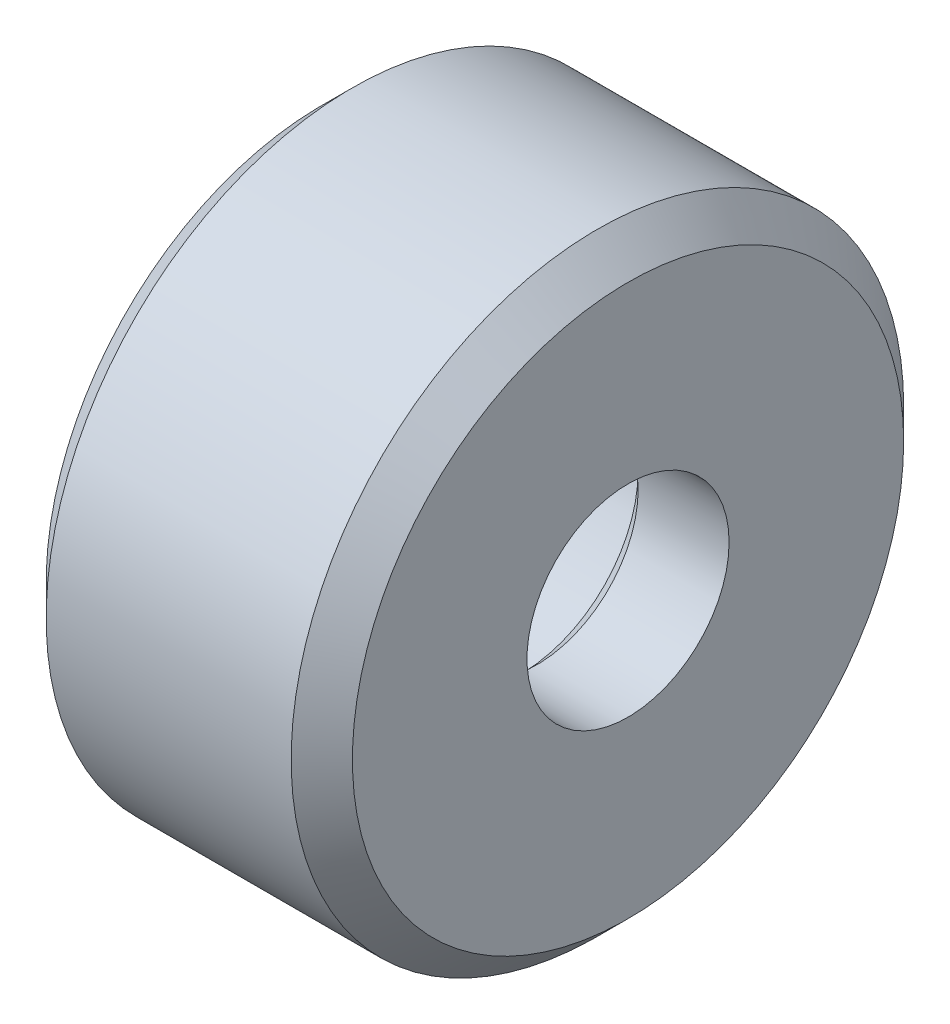
ISO-10303-21;
HEADER;
FILE_DESCRIPTION(('STEP AP214'),'2;1');
FILE_NAME('part.step','',(''),(''),'','','');
FILE_SCHEMA(('AUTOMOTIVE_DESIGN { 1 0 10303 214 1 1 1 1 }'));
ENDSEC;
DATA;
#1=APPLICATION_CONTEXT('core data for automotive mechanical design processes');
#2=APPLICATION_PROTOCOL_DEFINITION('international standard','automotive_design',2000,#1);
#3=PRODUCT_CONTEXT('',#1,'mechanical');
#4=PRODUCT('Part','Part','',(#3));
#5=PRODUCT_RELATED_PRODUCT_CATEGORY('part','',(#4));
#6=PRODUCT_DEFINITION_FORMATION('','',#4);
#7=PRODUCT_DEFINITION_CONTEXT('part definition',#1,'design');
#8=PRODUCT_DEFINITION('design','',#6,#7);
#9=PRODUCT_DEFINITION_SHAPE('','',#8);
#10=(LENGTH_UNIT() NAMED_UNIT(*) SI_UNIT(.MILLI.,.METRE.));
#11=(NAMED_UNIT(*) PLANE_ANGLE_UNIT() SI_UNIT($,.RADIAN.));
#12=(NAMED_UNIT(*) SI_UNIT($,.STERADIAN.) SOLID_ANGLE_UNIT());
#13=UNCERTAINTY_MEASURE_WITH_UNIT(LENGTH_MEASURE(1.E-05),#10,'distance_accuracy_value','');
#14=(GEOMETRIC_REPRESENTATION_CONTEXT(3) GLOBAL_UNCERTAINTY_ASSIGNED_CONTEXT((#13)) GLOBAL_UNIT_ASSIGNED_CONTEXT((#10,
#11,#12)) REPRESENTATION_CONTEXT('',''));
#15=CARTESIAN_POINT('',(0.,0.,0.));
#16=DIRECTION('',(0.,0.,1.));
#17=DIRECTION('',(1.,0.,0.));
#18=AXIS2_PLACEMENT_3D('',#15,#16,#17);
#19=CARTESIAN_POINT('',(10.,0.,0.));
#20=DIRECTION('',(1.,0.,0.));
#21=DIRECTION('',(0.,0.,-1.));
#22=AXIS2_PLACEMENT_3D('',#19,#20,#21);
#23=CYLINDRICAL_SURFACE('',#22,3.3);
#24=CARTESIAN_POINT('',(7.03033008588991,0.,0.));
#25=DIRECTION('',(1.,0.,0.));
#26=DIRECTION('',(0.,0.,-1.));
#27=AXIS2_PLACEMENT_3D('',#24,#25,#26);
#28=CIRCLE('',#27,3.3);
#29=CARTESIAN_POINT('',(7.03033008588991,0.,-3.3));
#30=VERTEX_POINT('',#29);
#31=EDGE_CURVE('E10',#30,#30,#28,.T.);
#32=ORIENTED_EDGE('',*,*,#31,.F.);
#33=EDGE_LOOP('',(#32));
#34=FACE_BOUND('',#33,.T.);
#35=CARTESIAN_POINT('',(10.,0.,0.));
#36=DIRECTION('',(1.,0.,0.));
#37=DIRECTION('',(0.,0.,-1.));
#38=AXIS2_PLACEMENT_3D('',#35,#36,#37);
#39=CIRCLE('',#38,3.3);
#40=CARTESIAN_POINT('',(10.,0.,-3.3));
#41=VERTEX_POINT('',#40);
#42=EDGE_CURVE('E80',#41,#41,#39,.T.);
#43=ORIENTED_EDGE('',*,*,#42,.T.);
#44=EDGE_LOOP('',(#43));
#45=FACE_BOUND('',#44,.T.);
#46=ADVANCED_FACE('F16',(#34,#45),#23,.F.);
#47=CARTESIAN_POINT('',(6.5,0.,0.));
#48=DIRECTION('',(-1.,0.,0.));
#49=DIRECTION('',(0.,0.,1.));
#50=AXIS2_PLACEMENT_3D('',#47,#48,#49);
#51=CONICAL_SURFACE('',#50,3.83033008588991,0.785398163397449);
#52=CARTESIAN_POINT('',(6.5,0.,0.));
#53=DIRECTION('',(1.,0.,0.));
#54=DIRECTION('',(0.,0.,-1.));
#55=AXIS2_PLACEMENT_3D('',#52,#53,#54);
#56=CIRCLE('',#55,3.83033008588991);
#57=CARTESIAN_POINT('',(6.5,0.,-3.83033008588991));
#58=VERTEX_POINT('',#57);
#59=EDGE_CURVE('E24',#58,#58,#56,.T.);
#60=ORIENTED_EDGE('',*,*,#59,.F.);
#61=EDGE_LOOP('',(#60));
#62=FACE_BOUND('',#61,.T.);
#63=ORIENTED_EDGE('',*,*,#31,.T.);
#64=EDGE_LOOP('',(#63));
#65=FACE_BOUND('',#64,.T.);
#66=ADVANCED_FACE('F131',(#62,#65),#51,.F.);
#67=CARTESIAN_POINT('',(6.5,5.5,0.));
#68=DIRECTION('',(-1.,0.,0.));
#69=DIRECTION('',(0.,0.,1.));
#70=AXIS2_PLACEMENT_3D('',#67,#68,#69);
#71=PLANE('',#70);
#72=CARTESIAN_POINT('',(6.5,0.,0.));
#73=DIRECTION('',(1.,0.,0.));
#74=DIRECTION('',(0.,0.,-1.));
#75=AXIS2_PLACEMENT_3D('',#72,#73,#74);
#76=CIRCLE('',#75,5.5);
#77=CARTESIAN_POINT('',(6.5,0.,-5.5));
#78=VERTEX_POINT('',#77);
#79=EDGE_CURVE('E83',#78,#78,#76,.T.);
#80=ORIENTED_EDGE('',*,*,#79,.F.);
#81=EDGE_LOOP('',(#80));
#82=FACE_BOUND('',#81,.T.);
#83=ORIENTED_EDGE('',*,*,#59,.T.);
#84=EDGE_LOOP('',(#83));
#85=FACE_BOUND('',#84,.T.);
#86=ADVANCED_FACE('F136',(#82,#85),#71,.T.);
#87=CARTESIAN_POINT('',(10.,0.,0.));
#88=DIRECTION('',(1.,0.,0.));
#89=DIRECTION('',(0.,0.,-1.));
#90=AXIS2_PLACEMENT_3D('',#87,#88,#89);
#91=CYLINDRICAL_SURFACE('',#90,5.5);
#92=CARTESIAN_POINT('',(0.,0.,0.));
#93=DIRECTION('',(1.,0.,0.));
#94=DIRECTION('',(0.,0.,-1.));
#95=AXIS2_PLACEMENT_3D('',#92,#93,#94);
#96=CIRCLE('',#95,5.5);
#97=CARTESIAN_POINT('',(0.,0.,-5.5));
#98=VERTEX_POINT('',#97);
#99=EDGE_CURVE('E73',#98,#98,#96,.T.);
#100=ORIENTED_EDGE('',*,*,#99,.F.);
#101=EDGE_LOOP('',(#100));
#102=FACE_BOUND('',#101,.T.);
#103=ORIENTED_EDGE('',*,*,#79,.T.);
#104=EDGE_LOOP('',(#103));
#105=FACE_BOUND('',#104,.T.);
#106=ADVANCED_FACE('F144',(#102,#105),#91,.F.);
#107=CARTESIAN_POINT('',(10.,9.,0.));
#108=DIRECTION('',(-1.,0.,0.));
#109=DIRECTION('',(0.,0.,1.));
#110=AXIS2_PLACEMENT_3D('',#107,#108,#109);
#111=PLANE('',#110);
#112=CARTESIAN_POINT('',(10.,0.,0.));
#113=DIRECTION('',(1.,0.,0.));
#114=DIRECTION('',(0.,0.,-1.));
#115=AXIS2_PLACEMENT_3D('',#112,#113,#114);
#116=CIRCLE('',#115,9.);
#117=CARTESIAN_POINT('',(10.,0.,-9.));
#118=VERTEX_POINT('',#117);
#119=EDGE_CURVE('E84',#118,#118,#116,.T.);
#120=ORIENTED_EDGE('',*,*,#119,.T.);
#121=EDGE_LOOP('',(#120));
#122=FACE_BOUND('',#121,.T.);
#123=ORIENTED_EDGE('',*,*,#42,.F.);
#124=EDGE_LOOP('',(#123));
#125=FACE_BOUND('',#124,.T.);
#126=ADVANCED_FACE('F149',(#122,#125),#111,.F.);
#127=CARTESIAN_POINT('',(9.,0.,0.));
#128=DIRECTION('',(-1.,0.,0.));
#129=DIRECTION('',(0.,0.,1.));
#130=AXIS2_PLACEMENT_3D('',#127,#128,#129);
#131=CONICAL_SURFACE('',#130,10.,0.785398163397448);
#132=CARTESIAN_POINT('',(9.,0.,0.));
#133=DIRECTION('',(1.,0.,0.));
#134=DIRECTION('',(0.,0.,-1.));
#135=AXIS2_PLACEMENT_3D('',#132,#133,#134);
#136=CIRCLE('',#135,10.);
#137=CARTESIAN_POINT('',(9.,0.,-10.));
#138=VERTEX_POINT('',#137);
#139=EDGE_CURVE('E54',#138,#138,#136,.T.);
#140=ORIENTED_EDGE('',*,*,#139,.T.);
#141=EDGE_LOOP('',(#140));
#142=FACE_BOUND('',#141,.T.);
#143=ORIENTED_EDGE('',*,*,#119,.F.);
#144=EDGE_LOOP('',(#143));
#145=FACE_BOUND('',#144,.T.);
#146=ADVANCED_FACE('F125',(#142,#145),#131,.T.);
#147=CARTESIAN_POINT('',(10.,0.,0.));
#148=DIRECTION('',(1.,0.,0.));
#149=DIRECTION('',(0.,0.,-1.));
#150=AXIS2_PLACEMENT_3D('',#147,#148,#149);
#151=CYLINDRICAL_SURFACE('',#150,10.);
#152=CARTESIAN_POINT('',(1.,0.,0.));
#153=DIRECTION('',(1.,0.,0.));
#154=DIRECTION('',(0.,0.,-1.));
#155=AXIS2_PLACEMENT_3D('',#152,#153,#154);
#156=CIRCLE('',#155,10.);
#157=CARTESIAN_POINT('',(1.,0.,-10.));
#158=VERTEX_POINT('',#157);
#159=EDGE_CURVE('E64',#158,#158,#156,.T.);
#160=ORIENTED_EDGE('',*,*,#159,.T.);
#161=EDGE_LOOP('',(#160));
#162=FACE_BOUND('',#161,.T.);
#163=ORIENTED_EDGE('',*,*,#139,.F.);
#164=EDGE_LOOP('',(#163));
#165=FACE_BOUND('',#164,.T.);
#166=ADVANCED_FACE('F115',(#162,#165),#151,.T.);
#167=CARTESIAN_POINT('',(0.,0.,0.));
#168=DIRECTION('',(1.,0.,0.));
#169=DIRECTION('',(0.,0.,-1.));
#170=AXIS2_PLACEMENT_3D('',#167,#168,#169);
#171=CONICAL_SURFACE('',#170,9.,0.785398163397448);
#172=CARTESIAN_POINT('',(0.,0.,0.));
#173=DIRECTION('',(1.,0.,0.));
#174=DIRECTION('',(0.,0.,-1.));
#175=AXIS2_PLACEMENT_3D('',#172,#173,#174);
#176=CIRCLE('',#175,9.);
#177=CARTESIAN_POINT('',(0.,0.,-9.));
#178=VERTEX_POINT('',#177);
#179=EDGE_CURVE('E237',#178,#178,#176,.T.);
#180=ORIENTED_EDGE('',*,*,#179,.T.);
#181=EDGE_LOOP('',(#180));
#182=FACE_BOUND('',#181,.T.);
#183=ORIENTED_EDGE('',*,*,#159,.F.);
#184=EDGE_LOOP('',(#183));
#185=FACE_BOUND('',#184,.T.);
#186=ADVANCED_FACE('F105',(#182,#185),#171,.T.);
#187=CARTESIAN_POINT('',(0.,0.,0.));
#188=DIRECTION('',(1.,0.,0.));
#189=DIRECTION('',(0.,1.,0.));
#190=AXIS2_PLACEMENT_3D('',#187,#188,#189);
#191=PLANE('',#190);
#192=ORIENTED_EDGE('',*,*,#99,.T.);
#193=EDGE_LOOP('',(#192));
#194=FACE_BOUND('',#193,.T.);
#195=ORIENTED_EDGE('',*,*,#179,.F.);
#196=EDGE_LOOP('',(#195));
#197=FACE_BOUND('',#196,.T.);
#198=ADVANCED_FACE('F100',(#194,#197),#191,.F.);
#199=CLOSED_SHELL('',(#46,#66,#86,#106,#126,#146,#166,#186,#198));
#200=MANIFOLD_SOLID_BREP('B1',#199);
#201=ADVANCED_BREP_SHAPE_REPRESENTATION('',(#18,#200),#14);
#202=SHAPE_DEFINITION_REPRESENTATION(#9,#201);
ENDSEC;
END-ISO-10303-21;
